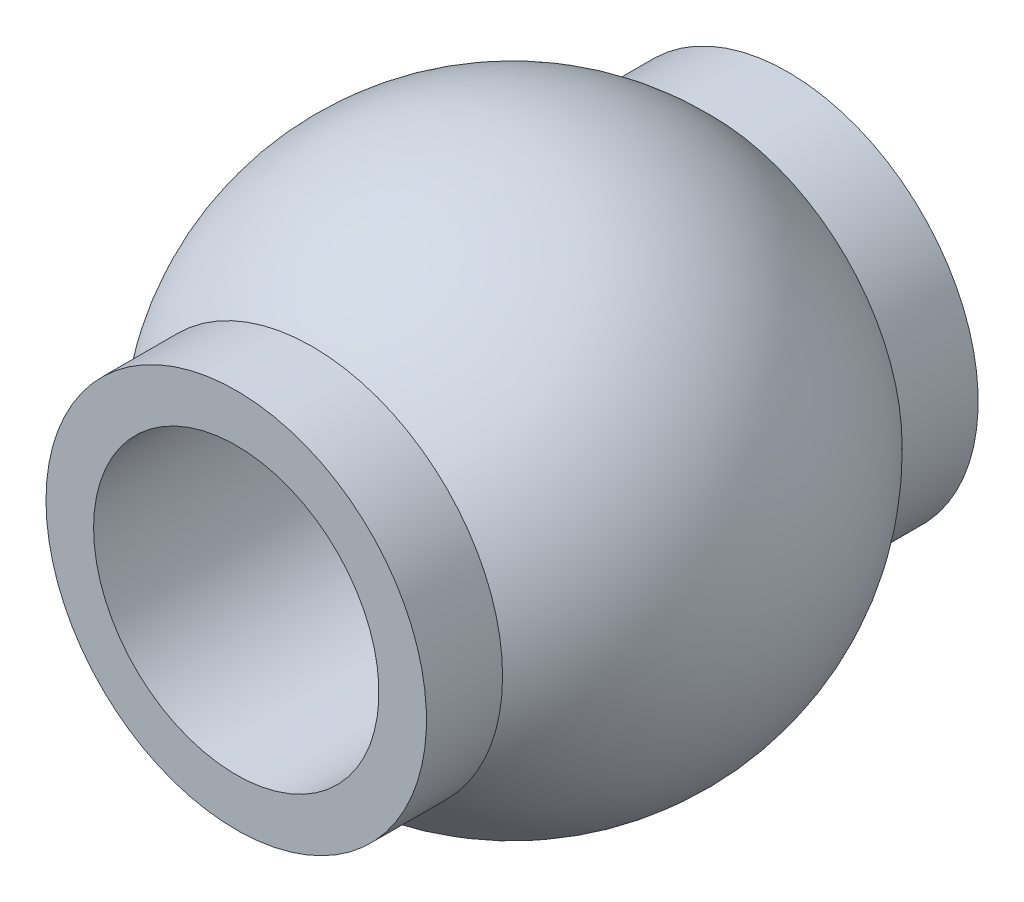
ISO-10303-21;
HEADER;
FILE_DESCRIPTION(('STEP AP214'),'2;1');
FILE_NAME('part.step','',(''),(''),'','','');
FILE_SCHEMA(('AUTOMOTIVE_DESIGN { 1 0 10303 214 1 1 1 1 }'));
ENDSEC;
DATA;
#1=APPLICATION_CONTEXT('core data for automotive mechanical design processes');
#2=APPLICATION_PROTOCOL_DEFINITION('international standard','automotive_design',2000,#1);
#3=PRODUCT_CONTEXT('',#1,'mechanical');
#4=PRODUCT('Part','Part','',(#3));
#5=PRODUCT_RELATED_PRODUCT_CATEGORY('part','',(#4));
#6=PRODUCT_DEFINITION_FORMATION('','',#4);
#7=PRODUCT_DEFINITION_CONTEXT('part definition',#1,'design');
#8=PRODUCT_DEFINITION('design','',#6,#7);
#9=PRODUCT_DEFINITION_SHAPE('','',#8);
#10=(LENGTH_UNIT() NAMED_UNIT(*) SI_UNIT(.MILLI.,.METRE.));
#11=(NAMED_UNIT(*) PLANE_ANGLE_UNIT() SI_UNIT($,.RADIAN.));
#12=(NAMED_UNIT(*) SI_UNIT($,.STERADIAN.) SOLID_ANGLE_UNIT());
#13=UNCERTAINTY_MEASURE_WITH_UNIT(LENGTH_MEASURE(1.E-05),#10,'distance_accuracy_value','');
#14=(GEOMETRIC_REPRESENTATION_CONTEXT(3) GLOBAL_UNCERTAINTY_ASSIGNED_CONTEXT((#13)) GLOBAL_UNIT_ASSIGNED_CONTEXT((#10,
#11,#12)) REPRESENTATION_CONTEXT('',''));
#15=CARTESIAN_POINT('',(0.,0.,0.));
#16=DIRECTION('',(0.,0.,1.));
#17=DIRECTION('',(1.,0.,0.));
#18=AXIS2_PLACEMENT_3D('',#15,#16,#17);
#19=CARTESIAN_POINT('',(0.,0.,-3.55697588452641));
#20=DIRECTION('',(0.,0.,-1.));
#21=DIRECTION('',(-1.,0.,0.));
#22=AXIS2_PLACEMENT_3D('',#19,#20,#21);
#23=CYLINDRICAL_SURFACE('',#22,1.5);
#24=CARTESIAN_POINT('',(0.,0.,2.9));
#25=DIRECTION('',(0.,0.,-1.));
#26=DIRECTION('',(-1.,0.,0.));
#27=AXIS2_PLACEMENT_3D('',#24,#25,#26);
#28=CIRCLE('',#27,1.5);
#29=CARTESIAN_POINT('',(-1.5,0.,2.9));
#30=VERTEX_POINT('',#29);
#31=EDGE_CURVE('E10',#30,#30,#28,.T.);
#32=ORIENTED_EDGE('',*,*,#31,.F.);
#33=EDGE_LOOP('',(#32));
#34=FACE_BOUND('',#33,.T.);
#35=CARTESIAN_POINT('',(0.,0.,-2.9));
#36=DIRECTION('',(0.,0.,-1.));
#37=DIRECTION('',(-1.,0.,0.));
#38=AXIS2_PLACEMENT_3D('',#35,#36,#37);
#39=CIRCLE('',#38,1.5);
#40=CARTESIAN_POINT('',(-1.5,0.,-2.9));
#41=VERTEX_POINT('',#40);
#42=EDGE_CURVE('E61',#41,#41,#39,.T.);
#43=ORIENTED_EDGE('',*,*,#42,.T.);
#44=EDGE_LOOP('',(#43));
#45=FACE_BOUND('',#44,.T.);
#46=ADVANCED_FACE('F39',(#34,#45),#23,.F.);
#47=CARTESIAN_POINT('',(0.,0.,2.9));
#48=DIRECTION('',(0.,0.,-1.));
#49=DIRECTION('',(-1.,0.,0.));
#50=AXIS2_PLACEMENT_3D('',#47,#48,#49);
#51=PLANE('',#50);
#52=CARTESIAN_POINT('',(0.,0.,2.9));
#53=DIRECTION('',(0.,0.,-1.));
#54=DIRECTION('',(-1.,0.,0.));
#55=AXIS2_PLACEMENT_3D('',#52,#53,#54);
#56=CIRCLE('',#55,2.);
#57=CARTESIAN_POINT('',(-2.,0.,2.9));
#58=VERTEX_POINT('',#57);
#59=EDGE_CURVE('E45',#58,#58,#56,.T.);
#60=ORIENTED_EDGE('',*,*,#59,.F.);
#61=EDGE_LOOP('',(#60));
#62=FACE_BOUND('',#61,.T.);
#63=ORIENTED_EDGE('',*,*,#31,.T.);
#64=EDGE_LOOP('',(#63));
#65=FACE_BOUND('',#64,.T.);
#66=ADVANCED_FACE('F78',(#62,#65),#51,.F.);
#67=CARTESIAN_POINT('',(0.,0.,-3.55697588452641));
#68=DIRECTION('',(0.,0.,-1.));
#69=DIRECTION('',(-1.,0.,0.));
#70=AXIS2_PLACEMENT_3D('',#67,#68,#69);
#71=CYLINDRICAL_SURFACE('',#70,2.);
#72=ORIENTED_EDGE('',*,*,#59,.T.);
#73=EDGE_LOOP('',(#72));
#74=FACE_BOUND('',#73,.T.);
#75=CARTESIAN_POINT('',(0.,0.,2.1));
#76=DIRECTION('',(0.,0.,-1.));
#77=DIRECTION('',(-1.,0.,0.));
#78=AXIS2_PLACEMENT_3D('',#75,#76,#77);
#79=CIRCLE('',#78,2.);
#80=CARTESIAN_POINT('',(2.,0.,2.1));
#81=VERTEX_POINT('',#80);
#82=EDGE_CURVE('E49',#81,#81,#79,.T.);
#83=ORIENTED_EDGE('',*,*,#82,.F.);
#84=EDGE_LOOP('',(#83));
#85=FACE_BOUND('',#84,.T.);
#86=ADVANCED_FACE('F83',(#74,#85),#71,.T.);
#87=CARTESIAN_POINT('',(0.,0.,0.));
#88=DIRECTION('',(0.,0.,-1.));
#89=DIRECTION('',(1.,0.,0.));
#90=AXIS2_PLACEMENT_3D('',#87,#88,#89);
#91=SPHERICAL_SURFACE('',#90,2.9);
#92=CARTESIAN_POINT('',(0.,0.,-2.1));
#93=DIRECTION('',(0.,0.,-1.));
#94=DIRECTION('',(-1.,0.,0.));
#95=AXIS2_PLACEMENT_3D('',#92,#93,#94);
#96=CIRCLE('',#95,2.);
#97=CARTESIAN_POINT('',(2.,0.,-2.1));
#98=VERTEX_POINT('',#97);
#99=EDGE_CURVE('E53',#98,#98,#96,.T.);
#100=CARTESIAN_POINT('',(2.,0.,-2.1));
#101=CARTESIAN_POINT('',(2.03542885615934,0.,-2.0662598029557));
#102=CARTESIAN_POINT('',(2.070002258697,0.,-2.03162152430929));
#103=CARTESIAN_POINT('',(2.13735324208609,0.,-1.96064095328789));
#104=CARTESIAN_POINT('',(2.17013082293753,0.,-1.9242986609129));
#105=CARTESIAN_POINT('',(2.23380524851134,0.,-1.85000221190998));
#106=CARTESIAN_POINT('',(2.26470209323371,0.,-1.81204805528205));
#107=CARTESIAN_POINT('',(2.32453618093648,0.,-1.73462532450518));
#108=CARTESIAN_POINT('',(2.35347342391688,0.,-1.69515675035623));
#109=CARTESIAN_POINT('',(2.40931413081567,0.,-1.6148061963374));
#110=CARTESIAN_POINT('',(2.43621759473406,0.,-1.57392421646751));
#111=CARTESIAN_POINT('',(2.48792186312119,0.,-1.49085156645577));
#112=CARTESIAN_POINT('',(2.51272266758993,0.,-1.44866089631391));
#113=CARTESIAN_POINT('',(2.56015809784021,0.,-1.3630789102345));
#114=CARTESIAN_POINT('',(2.58279272362176,0.,-1.31968759429695));
#115=CARTESIAN_POINT('',(2.62583783114081,0.,-1.23181544195321));
#116=CARTESIAN_POINT('',(2.6462483128783,0.,-1.18733460554702));
#117=CARTESIAN_POINT('',(2.68479286122643,0.,-1.09739732621215));
#118=CARTESIAN_POINT('',(2.70292692783707,0.,-1.05194088328346));
#119=CARTESIAN_POINT('',(2.73687220514584,0.,-0.960168803785881));
#120=CARTESIAN_POINT('',(2.75268341584398,0.,-0.91385316721699));
#121=CARTESIAN_POINT('',(2.78194248919462,0.,-0.820481313578344));
#122=CARTESIAN_POINT('',(2.79539035184714,0.,-0.773425096508589));
#123=CARTESIAN_POINT('',(2.81988828948024,0.,-0.6786925916464));
#124=CARTESIAN_POINT('',(2.83093836446082,0.,-0.631016303853966));
#125=CARTESIAN_POINT('',(2.85061242778805,0.,-0.535165755301579));
#126=CARTESIAN_POINT('',(2.85923641613469,0.,-0.486991494541626));
#127=CARTESIAN_POINT('',(2.87403622038034,0.,-0.390268373107664));
#128=CARTESIAN_POINT('',(2.88021203627935,0.,-0.341719512433654));
#129=CARTESIAN_POINT('',(2.89009967952264,0.,-0.244371523565264));
#130=CARTESIAN_POINT('',(2.89381150686691,0.,-0.195572395370884));
#131=CARTESIAN_POINT('',(2.89876166710559,0.,-0.0978488447843357));
#132=CARTESIAN_POINT('',(2.9,0.,-0.048924422392168));
#133=CARTESIAN_POINT('',(2.9,0.,0.0489244223921674));
#134=CARTESIAN_POINT('',(2.89876166710559,0.,0.097848844784335));
#135=CARTESIAN_POINT('',(2.89381150686691,0.,0.195572395370883));
#136=CARTESIAN_POINT('',(2.89009967952264,0.,0.244371523565263));
#137=CARTESIAN_POINT('',(2.88021203627935,0.,0.341719512433653));
#138=CARTESIAN_POINT('',(2.87403622038034,0.,0.390268373107663));
#139=CARTESIAN_POINT('',(2.85923641613469,0.,0.486991494541626));
#140=CARTESIAN_POINT('',(2.85061242778805,0.,0.535165755301578));
#141=CARTESIAN_POINT('',(2.83093836446082,0.,0.631016303853965));
#142=CARTESIAN_POINT('',(2.81988828948024,0.,0.6786925916464));
#143=CARTESIAN_POINT('',(2.79539035184714,0.,0.773425096508589));
#144=CARTESIAN_POINT('',(2.78194248919462,0.,0.820481313578343));
#145=CARTESIAN_POINT('',(2.75268341584398,0.,0.913853167216989));
#146=CARTESIAN_POINT('',(2.73687220514585,0.,0.960168803785881));
#147=CARTESIAN_POINT('',(2.70292692783707,0.,1.05194088328346));
#148=CARTESIAN_POINT('',(2.68479286122643,0.,1.09739732621215));
#149=CARTESIAN_POINT('',(2.6462483128783,0.,1.18733460554702));
#150=CARTESIAN_POINT('',(2.62583783114081,0.,1.23181544195321));
#151=CARTESIAN_POINT('',(2.58279272362176,0.,1.31968759429695));
#152=CARTESIAN_POINT('',(2.56015809784021,0.,1.3630789102345));
#153=CARTESIAN_POINT('',(2.51272266758993,0.,1.44866089631391));
#154=CARTESIAN_POINT('',(2.48792186312119,0.,1.49085156645577));
#155=CARTESIAN_POINT('',(2.43621759473406,0.,1.57392421646751));
#156=CARTESIAN_POINT('',(2.40931413081567,0.,1.6148061963374));
#157=CARTESIAN_POINT('',(2.35347342391688,0.,1.69515675035623));
#158=CARTESIAN_POINT('',(2.32453618093648,0.,1.73462532450518));
#159=CARTESIAN_POINT('',(2.26470209323371,0.,1.81204805528205));
#160=CARTESIAN_POINT('',(2.23380524851134,0.,1.85000221190998));
#161=CARTESIAN_POINT('',(2.17013082293753,0.,1.9242986609129));
#162=CARTESIAN_POINT('',(2.13735324208609,0.,1.96064095328788));
#163=CARTESIAN_POINT('',(2.070002258697,0.,2.03162152430929));
#164=CARTESIAN_POINT('',(2.03542885615934,0.,2.0662598029557));
#165=CARTESIAN_POINT('',(2.,0.,2.1));
#166=B_SPLINE_CURVE_WITH_KNOTS('',3,(#100,#101,#102,#103,#104,#105,#106,#107,#108,#109,#110,
#111,#112,#113,#114,#115,#116,#117,#118,#119,#120,#121,#122,#123,#124,#125,#126,#127,#128,#129,
#130,#131,#132,#133,#134,#135,#136,#137,#138,#139,#140,#141,#142,#143,#144,#145,#146,#147,#148,
#149,#150,#151,#152,#153,#154,#155,#156,#157,#158,#159,#160,#161,#162,#163,#164,#165),
.UNSPECIFIED.,.F.,.F.,(4,2,2,2,2,2,2,2,2,2,2,2,2,2,2,2,2,2,2,2,2,2,2,2,2,2,2,2,2,2,2,2,4),(0.,
0.146757607911029,0.293515215822058,0.440272823733087,0.587030431644116,0.733788039555145,
0.880545647466174,1.0273032553772,1.17406086328823,1.32081847119926,1.46757607911029,
1.61433368702132,1.76109129493235,1.90784890284338,2.05460651075441,2.20136411866543,
2.34812172657646,2.49487933448749,2.64163694239852,2.78839455030955,2.93515215822058,
3.08190976613161,3.22866737404264,3.37542498195367,3.5221825898647,3.66894019777572,
3.81569780568675,3.96245541359778,4.10921302150881,4.25597062941984,4.40272823733087,
4.5494858452419,4.69624345315293),.UNSPECIFIED.);
#167=EDGE_CURVE('BSEAM74',#98,#81,#166,.T.);
#168=ORIENTED_EDGE('',*,*,#99,.F.);
#169=ORIENTED_EDGE('',*,*,#82,.T.);
#170=ORIENTED_EDGE('',*,*,#167,.T.);
#171=ORIENTED_EDGE('',*,*,#167,.F.);
#172=EDGE_LOOP('',(#168,#170,#169,#171));
#173=FACE_BOUND('',#172,.T.);
#174=ADVANCED_FACE('F74',(#173),#91,.T.);
#175=CARTESIAN_POINT('',(0.,0.,-3.55697588452641));
#176=DIRECTION('',(0.,0.,-1.));
#177=DIRECTION('',(-1.,0.,0.));
#178=AXIS2_PLACEMENT_3D('',#175,#176,#177);
#179=CYLINDRICAL_SURFACE('',#178,2.);
#180=ORIENTED_EDGE('',*,*,#99,.T.);
#181=EDGE_LOOP('',(#180));
#182=FACE_BOUND('',#181,.T.);
#183=CARTESIAN_POINT('',(0.,0.,-2.9));
#184=DIRECTION('',(0.,0.,-1.));
#185=DIRECTION('',(-1.,0.,0.));
#186=AXIS2_PLACEMENT_3D('',#183,#184,#185);
#187=CIRCLE('',#186,2.);
#188=CARTESIAN_POINT('',(-2.,0.,-2.9));
#189=VERTEX_POINT('',#188);
#190=EDGE_CURVE('E58',#189,#189,#187,.T.);
#191=ORIENTED_EDGE('',*,*,#190,.F.);
#192=EDGE_LOOP('',(#191));
#193=FACE_BOUND('',#192,.T.);
#194=ADVANCED_FACE('F68',(#182,#193),#179,.T.);
#195=CARTESIAN_POINT('',(0.,0.,-2.9));
#196=DIRECTION('',(0.,0.,-1.));
#197=DIRECTION('',(-1.,0.,0.));
#198=AXIS2_PLACEMENT_3D('',#195,#196,#197);
#199=PLANE('',#198);
#200=ORIENTED_EDGE('',*,*,#190,.T.);
#201=EDGE_LOOP('',(#200));
#202=FACE_BOUND('',#201,.T.);
#203=ORIENTED_EDGE('',*,*,#42,.F.);
#204=EDGE_LOOP('',(#203));
#205=FACE_BOUND('',#204,.T.);
#206=ADVANCED_FACE('F66',(#202,#205),#199,.T.);
#207=CLOSED_SHELL('',(#46,#66,#86,#174,#194,#206));
#208=MANIFOLD_SOLID_BREP('B2',#207);
#209=ADVANCED_BREP_SHAPE_REPRESENTATION('',(#18,#208),#14);
#210=SHAPE_DEFINITION_REPRESENTATION(#9,#209);
ENDSEC;
END-ISO-10303-21;
